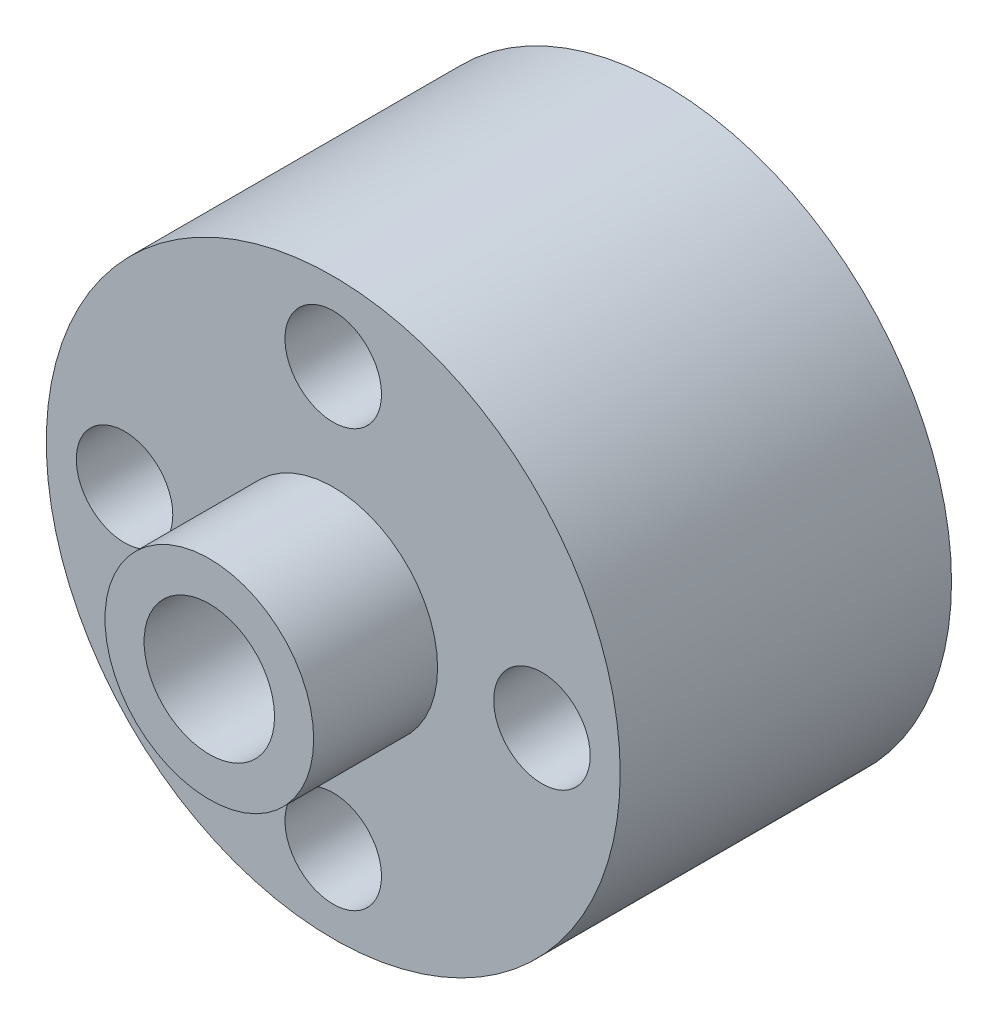
ISO-10303-21;
HEADER;
FILE_DESCRIPTION(('STEP AP214'),'2;1');
FILE_NAME('part.step','',(''),(''),'','','');
FILE_SCHEMA(('AUTOMOTIVE_DESIGN { 1 0 10303 214 1 1 1 1 }'));
ENDSEC;
DATA;
#1=APPLICATION_CONTEXT('core data for automotive mechanical design processes');
#2=APPLICATION_PROTOCOL_DEFINITION('international standard','automotive_design',2000,#1);
#3=PRODUCT_CONTEXT('',#1,'mechanical');
#4=PRODUCT('Part','Part','',(#3));
#5=PRODUCT_RELATED_PRODUCT_CATEGORY('part','',(#4));
#6=PRODUCT_DEFINITION_FORMATION('','',#4);
#7=PRODUCT_DEFINITION_CONTEXT('part definition',#1,'design');
#8=PRODUCT_DEFINITION('design','',#6,#7);
#9=PRODUCT_DEFINITION_SHAPE('','',#8);
#10=(LENGTH_UNIT() NAMED_UNIT(*) SI_UNIT(.MILLI.,.METRE.));
#11=(NAMED_UNIT(*) PLANE_ANGLE_UNIT() SI_UNIT($,.RADIAN.));
#12=(NAMED_UNIT(*) SI_UNIT($,.STERADIAN.) SOLID_ANGLE_UNIT());
#13=UNCERTAINTY_MEASURE_WITH_UNIT(LENGTH_MEASURE(1.E-05),#10,'distance_accuracy_value','');
#14=(GEOMETRIC_REPRESENTATION_CONTEXT(3) GLOBAL_UNCERTAINTY_ASSIGNED_CONTEXT((#13)) GLOBAL_UNIT_ASSIGNED_CONTEXT((#10,
#11,#12)) REPRESENTATION_CONTEXT('',''));
#15=CARTESIAN_POINT('',(0.,0.,0.));
#16=DIRECTION('',(0.,0.,1.));
#17=DIRECTION('',(1.,0.,0.));
#18=AXIS2_PLACEMENT_3D('',#15,#16,#17);
#19=CARTESIAN_POINT('',(0.,0.,6.35));
#20=DIRECTION('',(0.,0.,1.));
#21=DIRECTION('',(1.,0.,0.));
#22=AXIS2_PLACEMENT_3D('',#19,#20,#21);
#23=PLANE('',#22);
#24=CARTESIAN_POINT('',(0.,0.,6.35));
#25=DIRECTION('',(0.,0.,1.));
#26=DIRECTION('',(1.,0.,0.));
#27=AXIS2_PLACEMENT_3D('',#24,#25,#26);
#28=CIRCLE('',#27,11.);
#29=CARTESIAN_POINT('',(11.,0.,6.35));
#30=VERTEX_POINT('',#29);
#31=EDGE_CURVE('E34',#30,#30,#28,.T.);
#32=ORIENTED_EDGE('',*,*,#31,.T.);
#33=EDGE_LOOP('',(#32));
#34=FACE_BOUND('',#33,.T.);
#35=CARTESIAN_POINT('',(8.,0.,6.35));
#36=DIRECTION('',(0.,0.,1.));
#37=DIRECTION('',(1.,0.,0.));
#38=AXIS2_PLACEMENT_3D('',#35,#36,#37);
#39=CIRCLE('',#38,1.85);
#40=CARTESIAN_POINT('',(9.85,0.,6.35));
#41=VERTEX_POINT('',#40);
#42=EDGE_CURVE('E43',#41,#41,#39,.T.);
#43=ORIENTED_EDGE('',*,*,#42,.F.);
#44=EDGE_LOOP('',(#43));
#45=FACE_BOUND('',#44,.T.);
#46=CARTESIAN_POINT('',(-8.,0.,6.35));
#47=DIRECTION('',(0.,0.,1.));
#48=DIRECTION('',(1.,0.,0.));
#49=AXIS2_PLACEMENT_3D('',#46,#47,#48);
#50=CIRCLE('',#49,1.85);
#51=CARTESIAN_POINT('',(-6.15,0.,6.35));
#52=VERTEX_POINT('',#51);
#53=EDGE_CURVE('E49',#52,#52,#50,.T.);
#54=ORIENTED_EDGE('',*,*,#53,.F.);
#55=EDGE_LOOP('',(#54));
#56=FACE_BOUND('',#55,.T.);
#57=CARTESIAN_POINT('',(0.,-8.,6.35));
#58=DIRECTION('',(0.,0.,1.));
#59=DIRECTION('',(1.,0.,0.));
#60=AXIS2_PLACEMENT_3D('',#57,#58,#59);
#61=CIRCLE('',#60,1.85);
#62=CARTESIAN_POINT('',(1.85,-8.,6.35));
#63=VERTEX_POINT('',#62);
#64=EDGE_CURVE('E55',#63,#63,#61,.T.);
#65=ORIENTED_EDGE('',*,*,#64,.F.);
#66=EDGE_LOOP('',(#65));
#67=FACE_BOUND('',#66,.T.);
#68=CARTESIAN_POINT('',(0.,8.,6.35));
#69=DIRECTION('',(0.,0.,1.));
#70=DIRECTION('',(1.,0.,0.));
#71=AXIS2_PLACEMENT_3D('',#68,#69,#70);
#72=CIRCLE('',#71,1.85);
#73=CARTESIAN_POINT('',(1.85,8.,6.35));
#74=VERTEX_POINT('',#73);
#75=EDGE_CURVE('E61',#74,#74,#72,.T.);
#76=ORIENTED_EDGE('',*,*,#75,.F.);
#77=EDGE_LOOP('',(#76));
#78=FACE_BOUND('',#77,.T.);
#79=CARTESIAN_POINT('',(0.,0.,6.35));
#80=DIRECTION('',(0.,0.,1.));
#81=DIRECTION('',(1.,0.,0.));
#82=AXIS2_PLACEMENT_3D('',#79,#80,#81);
#83=CIRCLE('',#82,4.);
#84=CARTESIAN_POINT('',(4.,0.,6.35));
#85=VERTEX_POINT('',#84);
#86=EDGE_CURVE('E67',#85,#85,#83,.T.);
#87=ORIENTED_EDGE('',*,*,#86,.F.);
#88=EDGE_LOOP('',(#87));
#89=FACE_BOUND('',#88,.T.);
#90=ADVANCED_FACE('F30',(#34,#45,#56,#67,#78,#89),#23,.T.);
#91=CARTESIAN_POINT('',(0.,0.,-6.35));
#92=DIRECTION('',(0.,0.,1.));
#93=DIRECTION('',(1.,0.,0.));
#94=AXIS2_PLACEMENT_3D('',#91,#92,#93);
#95=CYLINDRICAL_SURFACE('',#94,11.);
#96=CARTESIAN_POINT('',(0.,0.,-6.35));
#97=DIRECTION('',(0.,0.,1.));
#98=DIRECTION('',(1.,0.,0.));
#99=AXIS2_PLACEMENT_3D('',#96,#97,#98);
#100=CIRCLE('',#99,11.);
#101=CARTESIAN_POINT('',(11.,0.,-6.35));
#102=VERTEX_POINT('',#101);
#103=EDGE_CURVE('E10',#102,#102,#100,.T.);
#104=ORIENTED_EDGE('',*,*,#103,.T.);
#105=EDGE_LOOP('',(#104));
#106=FACE_BOUND('',#105,.T.);
#107=ORIENTED_EDGE('',*,*,#31,.F.);
#108=EDGE_LOOP('',(#107));
#109=FACE_BOUND('',#108,.T.);
#110=ADVANCED_FACE('F32',(#106,#109),#95,.T.);
#111=CARTESIAN_POINT('',(0.,0.,-6.35));
#112=DIRECTION('',(0.,0.,1.));
#113=DIRECTION('',(1.,0.,0.));
#114=AXIS2_PLACEMENT_3D('',#111,#112,#113);
#115=PLANE('',#114);
#116=CARTESIAN_POINT('',(0.,0.,-6.35));
#117=DIRECTION('',(0.,0.,1.));
#118=DIRECTION('',(1.,0.,0.));
#119=AXIS2_PLACEMENT_3D('',#116,#117,#118);
#120=CIRCLE('',#119,4.);
#121=CARTESIAN_POINT('',(4.,0.,-6.35));
#122=VERTEX_POINT('',#121);
#123=EDGE_CURVE('E73',#122,#122,#120,.T.);
#124=ORIENTED_EDGE('',*,*,#123,.T.);
#125=EDGE_LOOP('',(#124));
#126=FACE_BOUND('',#125,.T.);
#127=CARTESIAN_POINT('',(0.,8.,-6.35));
#128=DIRECTION('',(0.,0.,1.));
#129=DIRECTION('',(1.,0.,0.));
#130=AXIS2_PLACEMENT_3D('',#127,#128,#129);
#131=CIRCLE('',#130,1.85);
#132=CARTESIAN_POINT('',(1.85,8.,-6.35));
#133=VERTEX_POINT('',#132);
#134=EDGE_CURVE('E58',#133,#133,#131,.T.);
#135=ORIENTED_EDGE('',*,*,#134,.T.);
#136=EDGE_LOOP('',(#135));
#137=FACE_BOUND('',#136,.T.);
#138=CARTESIAN_POINT('',(0.,-8.,-6.35));
#139=DIRECTION('',(0.,0.,1.));
#140=DIRECTION('',(1.,0.,0.));
#141=AXIS2_PLACEMENT_3D('',#138,#139,#140);
#142=CIRCLE('',#141,1.85);
#143=CARTESIAN_POINT('',(1.85,-8.,-6.35));
#144=VERTEX_POINT('',#143);
#145=EDGE_CURVE('E52',#144,#144,#142,.T.);
#146=ORIENTED_EDGE('',*,*,#145,.T.);
#147=EDGE_LOOP('',(#146));
#148=FACE_BOUND('',#147,.T.);
#149=CARTESIAN_POINT('',(-8.,0.,-6.35));
#150=DIRECTION('',(0.,0.,1.));
#151=DIRECTION('',(1.,0.,0.));
#152=AXIS2_PLACEMENT_3D('',#149,#150,#151);
#153=CIRCLE('',#152,1.85);
#154=CARTESIAN_POINT('',(-6.15,0.,-6.35));
#155=VERTEX_POINT('',#154);
#156=EDGE_CURVE('E46',#155,#155,#153,.T.);
#157=ORIENTED_EDGE('',*,*,#156,.T.);
#158=EDGE_LOOP('',(#157));
#159=FACE_BOUND('',#158,.T.);
#160=CARTESIAN_POINT('',(8.,0.,-6.35));
#161=DIRECTION('',(0.,0.,1.));
#162=DIRECTION('',(1.,0.,0.));
#163=AXIS2_PLACEMENT_3D('',#160,#161,#162);
#164=CIRCLE('',#163,1.85);
#165=CARTESIAN_POINT('',(9.85,0.,-6.35));
#166=VERTEX_POINT('',#165);
#167=EDGE_CURVE('E41',#166,#166,#164,.T.);
#168=ORIENTED_EDGE('',*,*,#167,.T.);
#169=EDGE_LOOP('',(#168));
#170=FACE_BOUND('',#169,.T.);
#171=ORIENTED_EDGE('',*,*,#103,.F.);
#172=EDGE_LOOP('',(#171));
#173=FACE_BOUND('',#172,.T.);
#174=ADVANCED_FACE('F113',(#126,#137,#148,#159,#170,#173),#115,.F.);
#175=CARTESIAN_POINT('',(8.,0.,-6.35));
#176=DIRECTION('',(0.,0.,1.));
#177=DIRECTION('',(1.,0.,0.));
#178=AXIS2_PLACEMENT_3D('',#175,#176,#177);
#179=CYLINDRICAL_SURFACE('',#178,1.85);
#180=ORIENTED_EDGE('',*,*,#167,.F.);
#181=EDGE_LOOP('',(#180));
#182=FACE_BOUND('',#181,.T.);
#183=ORIENTED_EDGE('',*,*,#42,.T.);
#184=EDGE_LOOP('',(#183));
#185=FACE_BOUND('',#184,.T.);
#186=ADVANCED_FACE('F118',(#182,#185),#179,.F.);
#187=CARTESIAN_POINT('',(-8.,0.,-6.35));
#188=DIRECTION('',(0.,0.,1.));
#189=DIRECTION('',(1.,0.,0.));
#190=AXIS2_PLACEMENT_3D('',#187,#188,#189);
#191=CYLINDRICAL_SURFACE('',#190,1.85);
#192=ORIENTED_EDGE('',*,*,#156,.F.);
#193=EDGE_LOOP('',(#192));
#194=FACE_BOUND('',#193,.T.);
#195=ORIENTED_EDGE('',*,*,#53,.T.);
#196=EDGE_LOOP('',(#195));
#197=FACE_BOUND('',#196,.T.);
#198=ADVANCED_FACE('F122',(#194,#197),#191,.F.);
#199=CARTESIAN_POINT('',(0.,-8.,-6.35));
#200=DIRECTION('',(0.,0.,1.));
#201=DIRECTION('',(1.,0.,0.));
#202=AXIS2_PLACEMENT_3D('',#199,#200,#201);
#203=CYLINDRICAL_SURFACE('',#202,1.85);
#204=ORIENTED_EDGE('',*,*,#145,.F.);
#205=EDGE_LOOP('',(#204));
#206=FACE_BOUND('',#205,.T.);
#207=ORIENTED_EDGE('',*,*,#64,.T.);
#208=EDGE_LOOP('',(#207));
#209=FACE_BOUND('',#208,.T.);
#210=ADVANCED_FACE('F126',(#206,#209),#203,.F.);
#211=CARTESIAN_POINT('',(0.,8.,-6.35));
#212=DIRECTION('',(0.,0.,1.));
#213=DIRECTION('',(1.,0.,0.));
#214=AXIS2_PLACEMENT_3D('',#211,#212,#213);
#215=CYLINDRICAL_SURFACE('',#214,1.85);
#216=ORIENTED_EDGE('',*,*,#134,.F.);
#217=EDGE_LOOP('',(#216));
#218=FACE_BOUND('',#217,.T.);
#219=ORIENTED_EDGE('',*,*,#75,.T.);
#220=EDGE_LOOP('',(#219));
#221=FACE_BOUND('',#220,.T.);
#222=ADVANCED_FACE('F104',(#218,#221),#215,.F.);
#223=CARTESIAN_POINT('',(0.,0.,11.1));
#224=DIRECTION('',(0.,0.,-1.));
#225=DIRECTION('',(-1.,0.,0.));
#226=AXIS2_PLACEMENT_3D('',#223,#224,#225);
#227=CYLINDRICAL_SURFACE('',#226,4.);
#228=CARTESIAN_POINT('',(0.,0.,11.1));
#229=DIRECTION('',(0.,0.,1.));
#230=DIRECTION('',(1.,0.,0.));
#231=AXIS2_PLACEMENT_3D('',#228,#229,#230);
#232=CIRCLE('',#231,4.);
#233=CARTESIAN_POINT('',(4.,0.,11.1));
#234=VERTEX_POINT('',#233);
#235=EDGE_CURVE('E64',#234,#234,#232,.T.);
#236=ORIENTED_EDGE('',*,*,#235,.F.);
#237=EDGE_LOOP('',(#236));
#238=FACE_BOUND('',#237,.T.);
#239=ORIENTED_EDGE('',*,*,#86,.T.);
#240=EDGE_LOOP('',(#239));
#241=FACE_BOUND('',#240,.T.);
#242=ADVANCED_FACE('F98',(#238,#241),#227,.T.);
#243=CARTESIAN_POINT('',(0.,0.,11.1));
#244=DIRECTION('',(0.,0.,1.));
#245=DIRECTION('',(1.,0.,0.));
#246=AXIS2_PLACEMENT_3D('',#243,#244,#245);
#247=PLANE('',#246);
#248=CARTESIAN_POINT('',(0.,0.,11.1));
#249=DIRECTION('',(0.,0.,1.));
#250=DIRECTION('',(1.,0.,0.));
#251=AXIS2_PLACEMENT_3D('',#248,#249,#250);
#252=CIRCLE('',#251,2.5);
#253=CARTESIAN_POINT('',(2.5,0.,11.1));
#254=VERTEX_POINT('',#253);
#255=EDGE_CURVE('E79',#254,#254,#252,.T.);
#256=ORIENTED_EDGE('',*,*,#255,.F.);
#257=EDGE_LOOP('',(#256));
#258=FACE_BOUND('',#257,.T.);
#259=ORIENTED_EDGE('',*,*,#235,.T.);
#260=EDGE_LOOP('',(#259));
#261=FACE_BOUND('',#260,.T.);
#262=ADVANCED_FACE('F94',(#258,#261),#247,.T.);
#263=CARTESIAN_POINT('',(0.,0.,-11.1));
#264=DIRECTION('',(0.,0.,1.));
#265=DIRECTION('',(1.,0.,0.));
#266=AXIS2_PLACEMENT_3D('',#263,#264,#265);
#267=CYLINDRICAL_SURFACE('',#266,4.);
#268=CARTESIAN_POINT('',(0.,0.,-11.1));
#269=DIRECTION('',(0.,0.,1.));
#270=DIRECTION('',(1.,0.,0.));
#271=AXIS2_PLACEMENT_3D('',#268,#269,#270);
#272=CIRCLE('',#271,4.);
#273=CARTESIAN_POINT('',(4.,0.,-11.1));
#274=VERTEX_POINT('',#273);
#275=EDGE_CURVE('E70',#274,#274,#272,.T.);
#276=ORIENTED_EDGE('',*,*,#275,.T.);
#277=EDGE_LOOP('',(#276));
#278=FACE_BOUND('',#277,.T.);
#279=ORIENTED_EDGE('',*,*,#123,.F.);
#280=EDGE_LOOP('',(#279));
#281=FACE_BOUND('',#280,.T.);
#282=ADVANCED_FACE('F97',(#278,#281),#267,.T.);
#283=CARTESIAN_POINT('',(0.,0.,-11.1));
#284=DIRECTION('',(0.,0.,-1.));
#285=DIRECTION('',(1.,0.,0.));
#286=AXIS2_PLACEMENT_3D('',#283,#284,#285);
#287=PLANE('',#286);
#288=CARTESIAN_POINT('',(0.,0.,-11.1));
#289=DIRECTION('',(0.,0.,1.));
#290=DIRECTION('',(1.,0.,0.));
#291=AXIS2_PLACEMENT_3D('',#288,#289,#290);
#292=CIRCLE('',#291,2.5);
#293=CARTESIAN_POINT('',(2.5,0.,-11.1));
#294=VERTEX_POINT('',#293);
#295=EDGE_CURVE('E76',#294,#294,#292,.T.);
#296=ORIENTED_EDGE('',*,*,#295,.T.);
#297=EDGE_LOOP('',(#296));
#298=FACE_BOUND('',#297,.T.);
#299=ORIENTED_EDGE('',*,*,#275,.F.);
#300=EDGE_LOOP('',(#299));
#301=FACE_BOUND('',#300,.T.);
#302=ADVANCED_FACE('F85',(#298,#301),#287,.T.);
#303=CARTESIAN_POINT('',(0.,0.,-11.1));
#304=DIRECTION('',(0.,0.,1.));
#305=DIRECTION('',(1.,0.,0.));
#306=AXIS2_PLACEMENT_3D('',#303,#304,#305);
#307=CYLINDRICAL_SURFACE('',#306,2.5);
#308=ORIENTED_EDGE('',*,*,#295,.F.);
#309=EDGE_LOOP('',(#308));
#310=FACE_BOUND('',#309,.T.);
#311=ORIENTED_EDGE('',*,*,#255,.T.);
#312=EDGE_LOOP('',(#311));
#313=FACE_BOUND('',#312,.T.);
#314=ADVANCED_FACE('F88',(#310,#313),#307,.F.);
#315=CLOSED_SHELL('',(#90,#110,#174,#186,#198,#210,#222,#242,#262,#282,#302,#314));
#316=MANIFOLD_SOLID_BREP('B2',#315);
#317=ADVANCED_BREP_SHAPE_REPRESENTATION('',(#18,#316),#14);
#318=SHAPE_DEFINITION_REPRESENTATION(#9,#317);
ENDSEC;
END-ISO-10303-21;
